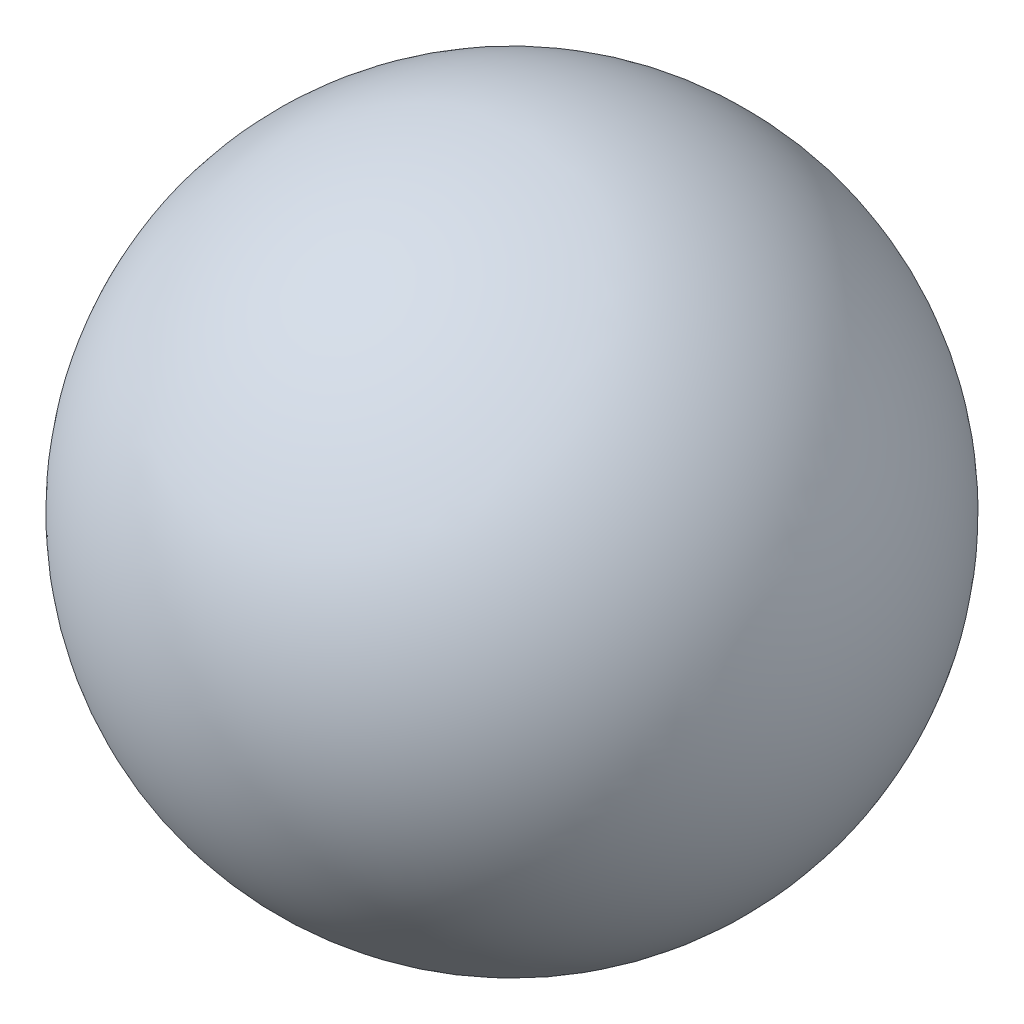
ISO-10303-21;
HEADER;
FILE_DESCRIPTION(('STEP AP214'),'2;1');
FILE_NAME('part.step','',(''),(''),'','','');
FILE_SCHEMA(('AUTOMOTIVE_DESIGN { 1 0 10303 214 1 1 1 1 }'));
ENDSEC;
DATA;
#1=APPLICATION_CONTEXT('core data for automotive mechanical design processes');
#2=APPLICATION_PROTOCOL_DEFINITION('international standard','automotive_design',2000,#1);
#3=PRODUCT_CONTEXT('',#1,'mechanical');
#4=PRODUCT('Part','Part','',(#3));
#5=PRODUCT_RELATED_PRODUCT_CATEGORY('part','',(#4));
#6=PRODUCT_DEFINITION_FORMATION('','',#4);
#7=PRODUCT_DEFINITION_CONTEXT('part definition',#1,'design');
#8=PRODUCT_DEFINITION('design','',#6,#7);
#9=PRODUCT_DEFINITION_SHAPE('','',#8);
#10=(LENGTH_UNIT() NAMED_UNIT(*) SI_UNIT(.MILLI.,.METRE.));
#11=(NAMED_UNIT(*) PLANE_ANGLE_UNIT() SI_UNIT($,.RADIAN.));
#12=(NAMED_UNIT(*) SI_UNIT($,.STERADIAN.) SOLID_ANGLE_UNIT());
#13=UNCERTAINTY_MEASURE_WITH_UNIT(LENGTH_MEASURE(1.E-05),#10,'distance_accuracy_value','');
#14=(GEOMETRIC_REPRESENTATION_CONTEXT(3) GLOBAL_UNCERTAINTY_ASSIGNED_CONTEXT((#13)) GLOBAL_UNIT_ASSIGNED_CONTEXT((#10,
#11,#12)) REPRESENTATION_CONTEXT('',''));
#15=CARTESIAN_POINT('',(0.,0.,0.));
#16=DIRECTION('',(0.,0.,1.));
#17=DIRECTION('',(1.,0.,0.));
#18=AXIS2_PLACEMENT_3D('',#15,#16,#17);
#19=CARTESIAN_POINT('',(0.,0.,0.));
#20=DIRECTION('',(-1.,0.,0.));
#21=DIRECTION('',(0.,1.,0.));
#22=AXIS2_PLACEMENT_3D('',#19,#20,#21);
#23=SPHERICAL_SURFACE('',#22,0.794);
#24=CARTESIAN_POINT('',(-0.794,0.,0.));
#25=VERTEX_POINT('',#24);
#26=VERTEX_LOOP('',#25);
#27=FACE_BOUND('',#26,.T.);
#28=ADVANCED_FACE('F35',(#27),#23,.T.);
#29=CLOSED_SHELL('',(#28));
#30=MANIFOLD_SOLID_BREP('B2',#29);
#31=ADVANCED_BREP_SHAPE_REPRESENTATION('',(#18,#30),#14);
#32=SHAPE_DEFINITION_REPRESENTATION(#9,#31);
ENDSEC;
END-ISO-10303-21;
